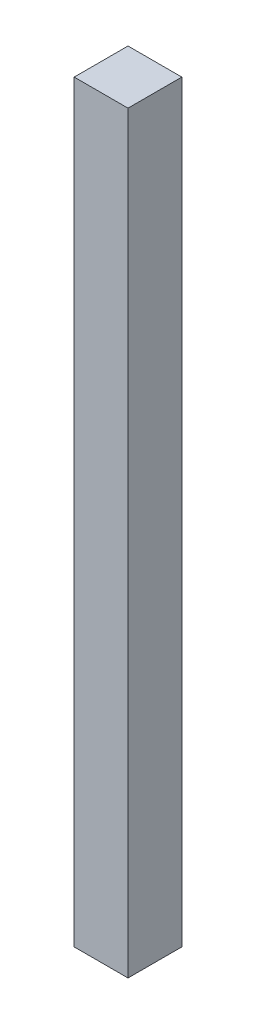
ISO-10303-21;
HEADER;
FILE_DESCRIPTION(('STEP AP214'),'2;1');
FILE_NAME('part.step','',(''),(''),'','','');
FILE_SCHEMA(('AUTOMOTIVE_DESIGN { 1 0 10303 214 1 1 1 1 }'));
ENDSEC;
DATA;
#1=APPLICATION_CONTEXT('core data for automotive mechanical design processes');
#2=APPLICATION_PROTOCOL_DEFINITION('international standard','automotive_design',2000,#1);
#3=PRODUCT_CONTEXT('',#1,'mechanical');
#4=PRODUCT('Part','Part','',(#3));
#5=PRODUCT_RELATED_PRODUCT_CATEGORY('part','',(#4));
#6=PRODUCT_DEFINITION_FORMATION('','',#4);
#7=PRODUCT_DEFINITION_CONTEXT('part definition',#1,'design');
#8=PRODUCT_DEFINITION('design','',#6,#7);
#9=PRODUCT_DEFINITION_SHAPE('','',#8);
#10=(LENGTH_UNIT() NAMED_UNIT(*) SI_UNIT(.MILLI.,.METRE.));
#11=(NAMED_UNIT(*) PLANE_ANGLE_UNIT() SI_UNIT($,.RADIAN.));
#12=(NAMED_UNIT(*) SI_UNIT($,.STERADIAN.) SOLID_ANGLE_UNIT());
#13=UNCERTAINTY_MEASURE_WITH_UNIT(LENGTH_MEASURE(1.E-05),#10,'distance_accuracy_value','');
#14=(GEOMETRIC_REPRESENTATION_CONTEXT(3) GLOBAL_UNCERTAINTY_ASSIGNED_CONTEXT((#13)) GLOBAL_UNIT_ASSIGNED_CONTEXT((#10,
#11,#12)) REPRESENTATION_CONTEXT('',''));
#15=CARTESIAN_POINT('',(0.,0.,0.));
#16=DIRECTION('',(0.,0.,1.));
#17=DIRECTION('',(1.,0.,0.));
#18=AXIS2_PLACEMENT_3D('',#15,#16,#17);
#19=CARTESIAN_POINT('',(10.,280.,-10.));
#20=DIRECTION('',(-1.,0.,0.));
#21=DIRECTION('',(0.,0.,1.));
#22=AXIS2_PLACEMENT_3D('',#19,#20,#21);
#23=PLANE('',#22);
#24=DIRECTION('',(0.,0.,-1.));
#25=VECTOR('',#24,1.);
#26=CARTESIAN_POINT('',(10.,0.,-10.));
#27=LINE('',#26,#25);
#28=CARTESIAN_POINT('',(10.,0.,10.));
#29=VERTEX_POINT('',#28);
#30=CARTESIAN_POINT('',(10.,0.,-10.));
#31=VERTEX_POINT('',#30);
#32=EDGE_CURVE('E96',#29,#31,#27,.T.);
#33=ORIENTED_EDGE('',*,*,#32,.T.);
#34=DIRECTION('',(0.,-1.,0.));
#35=VECTOR('',#34,1.);
#36=CARTESIAN_POINT('',(10.,280.,-10.));
#37=LINE('',#36,#35);
#38=CARTESIAN_POINT('',(10.,280.,-10.));
#39=VERTEX_POINT('',#38);
#40=EDGE_CURVE('E11',#39,#31,#37,.T.);
#41=ORIENTED_EDGE('',*,*,#40,.F.);
#42=DIRECTION('',(0.,0.,-1.));
#43=VECTOR('',#42,1.);
#44=CARTESIAN_POINT('',(10.,280.,-10.));
#45=LINE('',#44,#43);
#46=CARTESIAN_POINT('',(10.,280.,10.));
#47=VERTEX_POINT('',#46);
#48=EDGE_CURVE('E84',#47,#39,#45,.T.);
#49=ORIENTED_EDGE('',*,*,#48,.F.);
#50=DIRECTION('',(0.,-1.,0.));
#51=VECTOR('',#50,1.);
#52=CARTESIAN_POINT('',(10.,280.,10.));
#53=LINE('',#52,#51);
#54=EDGE_CURVE('E92',#47,#29,#53,.T.);
#55=ORIENTED_EDGE('',*,*,#54,.T.);
#56=EDGE_LOOP('',(#33,#41,#49,#55));
#57=FACE_BOUND('',#56,.T.);
#58=ADVANCED_FACE('F33',(#57),#23,.F.);
#59=CARTESIAN_POINT('',(-10.,280.,-10.));
#60=DIRECTION('',(0.,0.,1.));
#61=DIRECTION('',(1.,0.,0.));
#62=AXIS2_PLACEMENT_3D('',#59,#60,#61);
#63=PLANE('',#62);
#64=DIRECTION('',(-1.,0.,0.));
#65=VECTOR('',#64,1.);
#66=CARTESIAN_POINT('',(-10.,0.,-10.));
#67=LINE('',#66,#65);
#68=CARTESIAN_POINT('',(-10.,0.,-10.));
#69=VERTEX_POINT('',#68);
#70=EDGE_CURVE('E88',#31,#69,#67,.T.);
#71=ORIENTED_EDGE('',*,*,#70,.T.);
#72=DIRECTION('',(0.,-1.,0.));
#73=VECTOR('',#72,1.);
#74=CARTESIAN_POINT('',(-10.,280.,-10.));
#75=LINE('',#74,#73);
#76=CARTESIAN_POINT('',(-10.,280.,-10.));
#77=VERTEX_POINT('',#76);
#78=EDGE_CURVE('E41',#77,#69,#75,.T.);
#79=ORIENTED_EDGE('',*,*,#78,.F.);
#80=DIRECTION('',(-1.,0.,0.));
#81=VECTOR('',#80,1.);
#82=CARTESIAN_POINT('',(-10.,280.,-10.));
#83=LINE('',#82,#81);
#84=EDGE_CURVE('E79',#39,#77,#83,.T.);
#85=ORIENTED_EDGE('',*,*,#84,.F.);
#86=ORIENTED_EDGE('',*,*,#40,.T.);
#87=EDGE_LOOP('',(#71,#79,#85,#86));
#88=FACE_BOUND('',#87,.T.);
#89=ADVANCED_FACE('F87',(#88),#63,.F.);
#90=CARTESIAN_POINT('',(-10.,280.,-10.));
#91=DIRECTION('',(1.,0.,0.));
#92=DIRECTION('',(0.,0.,-1.));
#93=AXIS2_PLACEMENT_3D('',#90,#91,#92);
#94=PLANE('',#93);
#95=DIRECTION('',(0.,0.,1.));
#96=VECTOR('',#95,1.);
#97=CARTESIAN_POINT('',(-10.,0.,-10.));
#98=LINE('',#97,#96);
#99=CARTESIAN_POINT('',(-10.,0.,10.));
#100=VERTEX_POINT('',#99);
#101=EDGE_CURVE('E66',#69,#100,#98,.T.);
#102=ORIENTED_EDGE('',*,*,#101,.T.);
#103=DIRECTION('',(0.,-1.,0.));
#104=VECTOR('',#103,1.);
#105=CARTESIAN_POINT('',(-10.,280.,10.));
#106=LINE('',#105,#104);
#107=CARTESIAN_POINT('',(-10.,280.,10.));
#108=VERTEX_POINT('',#107);
#109=EDGE_CURVE('E89',#108,#100,#106,.T.);
#110=ORIENTED_EDGE('',*,*,#109,.F.);
#111=DIRECTION('',(0.,0.,1.));
#112=VECTOR('',#111,1.);
#113=CARTESIAN_POINT('',(-10.,280.,-10.));
#114=LINE('',#113,#112);
#115=EDGE_CURVE('E82',#77,#108,#114,.T.);
#116=ORIENTED_EDGE('',*,*,#115,.F.);
#117=ORIENTED_EDGE('',*,*,#78,.T.);
#118=EDGE_LOOP('',(#102,#110,#116,#117));
#119=FACE_BOUND('',#118,.T.);
#120=ADVANCED_FACE('F90',(#119),#94,.F.);
#121=CARTESIAN_POINT('',(-10.,280.,10.));
#122=DIRECTION('',(0.,0.,-1.));
#123=DIRECTION('',(-1.,0.,0.));
#124=AXIS2_PLACEMENT_3D('',#121,#122,#123);
#125=PLANE('',#124);
#126=DIRECTION('',(1.,0.,0.));
#127=VECTOR('',#126,1.);
#128=CARTESIAN_POINT('',(-10.,0.,10.));
#129=LINE('',#128,#127);
#130=EDGE_CURVE('E72',#100,#29,#129,.T.);
#131=ORIENTED_EDGE('',*,*,#130,.T.);
#132=ORIENTED_EDGE('',*,*,#54,.F.);
#133=DIRECTION('',(1.,0.,0.));
#134=VECTOR('',#133,1.);
#135=CARTESIAN_POINT('',(-10.,280.,10.));
#136=LINE('',#135,#134);
#137=EDGE_CURVE('E49',#108,#47,#136,.T.);
#138=ORIENTED_EDGE('',*,*,#137,.F.);
#139=ORIENTED_EDGE('',*,*,#109,.T.);
#140=EDGE_LOOP('',(#131,#132,#138,#139));
#141=FACE_BOUND('',#140,.T.);
#142=ADVANCED_FACE('F103',(#141),#125,.F.);
#143=CARTESIAN_POINT('',(0.,280.,0.));
#144=DIRECTION('',(0.,1.,0.));
#145=DIRECTION('',(0.,0.,1.));
#146=AXIS2_PLACEMENT_3D('',#143,#144,#145);
#147=PLANE('',#146);
#148=ORIENTED_EDGE('',*,*,#48,.T.);
#149=ORIENTED_EDGE('',*,*,#84,.T.);
#150=ORIENTED_EDGE('',*,*,#115,.T.);
#151=ORIENTED_EDGE('',*,*,#137,.T.);
#152=EDGE_LOOP('',(#148,#149,#150,#151));
#153=FACE_BOUND('',#152,.T.);
#154=ADVANCED_FACE('F80',(#153),#147,.T.);
#155=CARTESIAN_POINT('',(0.,0.,0.));
#156=DIRECTION('',(0.,1.,0.));
#157=DIRECTION('',(0.,0.,1.));
#158=AXIS2_PLACEMENT_3D('',#155,#156,#157);
#159=PLANE('',#158);
#160=ORIENTED_EDGE('',*,*,#32,.F.);
#161=ORIENTED_EDGE('',*,*,#130,.F.);
#162=ORIENTED_EDGE('',*,*,#101,.F.);
#163=ORIENTED_EDGE('',*,*,#70,.F.);
#164=EDGE_LOOP('',(#160,#161,#162,#163));
#165=FACE_BOUND('',#164,.T.);
#166=ADVANCED_FACE('F106',(#165),#159,.F.);
#167=CLOSED_SHELL('',(#58,#89,#120,#142,#154,#166));
#168=MANIFOLD_SOLID_BREP('B2',#167);
#169=ADVANCED_BREP_SHAPE_REPRESENTATION('',(#18,#168),#14);
#170=SHAPE_DEFINITION_REPRESENTATION(#9,#169);
ENDSEC;
END-ISO-10303-21;
